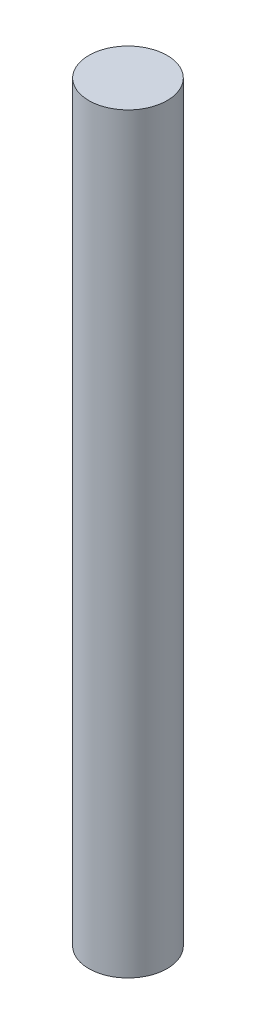
ISO-10303-21;
HEADER;
FILE_DESCRIPTION(('STEP AP214'),'2;1');
FILE_NAME('part.step','',(''),(''),'','','');
FILE_SCHEMA(('AUTOMOTIVE_DESIGN { 1 0 10303 214 1 1 1 1 }'));
ENDSEC;
DATA;
#1=APPLICATION_CONTEXT('core data for automotive mechanical design processes');
#2=APPLICATION_PROTOCOL_DEFINITION('international standard','automotive_design',2000,#1);
#3=PRODUCT_CONTEXT('',#1,'mechanical');
#4=PRODUCT('Part','Part','',(#3));
#5=PRODUCT_RELATED_PRODUCT_CATEGORY('part','',(#4));
#6=PRODUCT_DEFINITION_FORMATION('','',#4);
#7=PRODUCT_DEFINITION_CONTEXT('part definition',#1,'design');
#8=PRODUCT_DEFINITION('design','',#6,#7);
#9=PRODUCT_DEFINITION_SHAPE('','',#8);
#10=(LENGTH_UNIT() NAMED_UNIT(*) SI_UNIT(.MILLI.,.METRE.));
#11=(NAMED_UNIT(*) PLANE_ANGLE_UNIT() SI_UNIT($,.RADIAN.));
#12=(NAMED_UNIT(*) SI_UNIT($,.STERADIAN.) SOLID_ANGLE_UNIT());
#13=UNCERTAINTY_MEASURE_WITH_UNIT(LENGTH_MEASURE(1.E-05),#10,'distance_accuracy_value','');
#14=(GEOMETRIC_REPRESENTATION_CONTEXT(3) GLOBAL_UNCERTAINTY_ASSIGNED_CONTEXT((#13)) GLOBAL_UNIT_ASSIGNED_CONTEXT((#10,
#11,#12)) REPRESENTATION_CONTEXT('',''));
#15=CARTESIAN_POINT('',(0.,0.,0.));
#16=DIRECTION('',(0.,0.,1.));
#17=DIRECTION('',(1.,0.,0.));
#18=AXIS2_PLACEMENT_3D('',#15,#16,#17);
#19=CARTESIAN_POINT('',(0.,12.,0.));
#20=DIRECTION('',(0.,-1.,0.));
#21=DIRECTION('',(0.,0.,-1.));
#22=AXIS2_PLACEMENT_3D('',#19,#20,#21);
#23=CYLINDRICAL_SURFACE('',#22,0.625);
#24=CARTESIAN_POINT('',(0.,12.,0.));
#25=DIRECTION('',(0.,1.,0.));
#26=DIRECTION('',(0.,0.,1.));
#27=AXIS2_PLACEMENT_3D('',#24,#25,#26);
#28=CIRCLE('',#27,0.625);
#29=CARTESIAN_POINT('',(0.,12.,0.625));
#30=VERTEX_POINT('',#29);
#31=EDGE_CURVE('E10',#30,#30,#28,.T.);
#32=ORIENTED_EDGE('',*,*,#31,.F.);
#33=EDGE_LOOP('',(#32));
#34=FACE_BOUND('',#33,.T.);
#35=CARTESIAN_POINT('',(0.,0.,0.));
#36=DIRECTION('',(0.,1.,0.));
#37=DIRECTION('',(0.,0.,1.));
#38=AXIS2_PLACEMENT_3D('',#35,#36,#37);
#39=CIRCLE('',#38,0.625);
#40=CARTESIAN_POINT('',(0.,0.,0.625));
#41=VERTEX_POINT('',#40);
#42=EDGE_CURVE('E35',#41,#41,#39,.T.);
#43=ORIENTED_EDGE('',*,*,#42,.T.);
#44=EDGE_LOOP('',(#43));
#45=FACE_BOUND('',#44,.T.);
#46=ADVANCED_FACE('F32',(#34,#45),#23,.T.);
#47=CARTESIAN_POINT('',(0.,12.,0.));
#48=DIRECTION('',(0.,1.,0.));
#49=DIRECTION('',(0.,0.,1.));
#50=AXIS2_PLACEMENT_3D('',#47,#48,#49);
#51=PLANE('',#50);
#52=ORIENTED_EDGE('',*,*,#31,.T.);
#53=EDGE_LOOP('',(#52));
#54=FACE_BOUND('',#53,.T.);
#55=ADVANCED_FACE('F47',(#54),#51,.T.);
#56=CARTESIAN_POINT('',(0.,0.,0.));
#57=DIRECTION('',(0.,1.,0.));
#58=DIRECTION('',(0.,0.,1.));
#59=AXIS2_PLACEMENT_3D('',#56,#57,#58);
#60=PLANE('',#59);
#61=ORIENTED_EDGE('',*,*,#42,.F.);
#62=EDGE_LOOP('',(#61));
#63=FACE_BOUND('',#62,.T.);
#64=ADVANCED_FACE('F45',(#63),#60,.F.);
#65=CLOSED_SHELL('',(#46,#55,#64));
#66=MANIFOLD_SOLID_BREP('B2',#65);
#67=ADVANCED_BREP_SHAPE_REPRESENTATION('',(#18,#66),#14);
#68=SHAPE_DEFINITION_REPRESENTATION(#9,#67);
ENDSEC;
END-ISO-10303-21;
